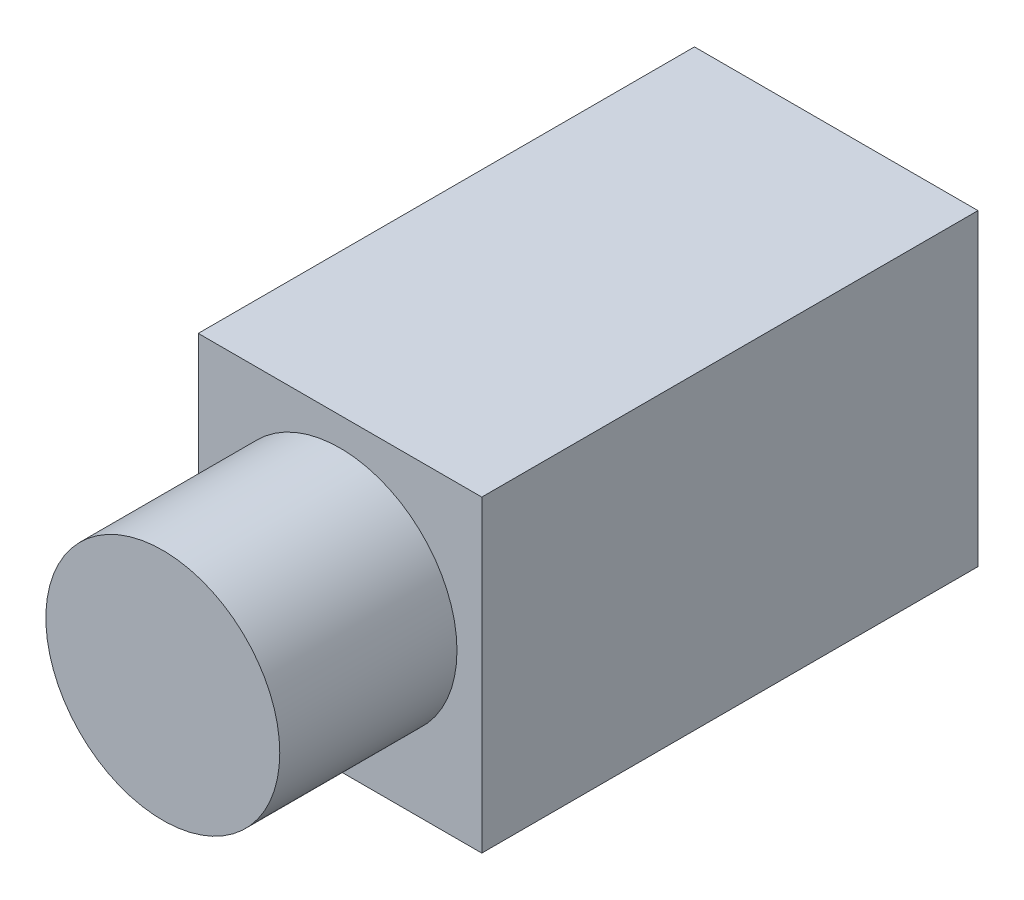
ISO-10303-21;
HEADER;
FILE_DESCRIPTION(('STEP AP214'),'2;1');
FILE_NAME('part.step','',(''),(''),'','','');
FILE_SCHEMA(('AUTOMOTIVE_DESIGN { 1 0 10303 214 1 1 1 1 }'));
ENDSEC;
DATA;
#1=APPLICATION_CONTEXT('core data for automotive mechanical design processes');
#2=APPLICATION_PROTOCOL_DEFINITION('international standard','automotive_design',2000,#1);
#3=PRODUCT_CONTEXT('',#1,'mechanical');
#4=PRODUCT('Part','Part','',(#3));
#5=PRODUCT_RELATED_PRODUCT_CATEGORY('part','',(#4));
#6=PRODUCT_DEFINITION_FORMATION('','',#4);
#7=PRODUCT_DEFINITION_CONTEXT('part definition',#1,'design');
#8=PRODUCT_DEFINITION('design','',#6,#7);
#9=PRODUCT_DEFINITION_SHAPE('','',#8);
#10=(LENGTH_UNIT() NAMED_UNIT(*) SI_UNIT(.MILLI.,.METRE.));
#11=(NAMED_UNIT(*) PLANE_ANGLE_UNIT() SI_UNIT($,.RADIAN.));
#12=(NAMED_UNIT(*) SI_UNIT($,.STERADIAN.) SOLID_ANGLE_UNIT());
#13=UNCERTAINTY_MEASURE_WITH_UNIT(LENGTH_MEASURE(1.E-05),#10,'distance_accuracy_value','');
#14=(GEOMETRIC_REPRESENTATION_CONTEXT(3) GLOBAL_UNCERTAINTY_ASSIGNED_CONTEXT((#13)) GLOBAL_UNIT_ASSIGNED_CONTEXT((#10,
#11,#12)) REPRESENTATION_CONTEXT('',''));
#15=CARTESIAN_POINT('',(0.,0.,0.));
#16=DIRECTION('',(0.,0.,1.));
#17=DIRECTION('',(1.,0.,0.));
#18=AXIS2_PLACEMENT_3D('',#15,#16,#17);
#19=CARTESIAN_POINT('',(20.,43.5,35.));
#20=DIRECTION('',(-1.,0.,0.));
#21=DIRECTION('',(0.,0.,1.));
#22=AXIS2_PLACEMENT_3D('',#19,#20,#21);
#23=PLANE('',#22);
#24=DIRECTION('',(0.,0.,-1.));
#25=VECTOR('',#24,1.);
#26=CARTESIAN_POINT('',(20.,0.,35.));
#27=LINE('',#26,#25);
#28=CARTESIAN_POINT('',(20.,0.,35.));
#29=VERTEX_POINT('',#28);
#30=CARTESIAN_POINT('',(20.,0.,-35.));
#31=VERTEX_POINT('',#30);
#32=EDGE_CURVE('E140',#29,#31,#27,.T.);
#33=ORIENTED_EDGE('',*,*,#32,.T.);
#34=DIRECTION('',(0.,-1.,0.));
#35=VECTOR('',#34,1.);
#36=CARTESIAN_POINT('',(20.,43.5,-35.));
#37=LINE('',#36,#35);
#38=CARTESIAN_POINT('',(20.,43.5,-35.));
#39=VERTEX_POINT('',#38);
#40=EDGE_CURVE('E46',#39,#31,#37,.T.);
#41=ORIENTED_EDGE('',*,*,#40,.F.);
#42=DIRECTION('',(0.,0.,-1.));
#43=VECTOR('',#42,1.);
#44=CARTESIAN_POINT('',(20.,43.5,35.));
#45=LINE('',#44,#43);
#46=CARTESIAN_POINT('',(20.,43.5,35.));
#47=VERTEX_POINT('',#46);
#48=EDGE_CURVE('E142',#47,#39,#45,.T.);
#49=ORIENTED_EDGE('',*,*,#48,.F.);
#50=DIRECTION('',(0.,-1.,0.));
#51=VECTOR('',#50,1.);
#52=CARTESIAN_POINT('',(20.,43.5,35.));
#53=LINE('',#52,#51);
#54=EDGE_CURVE('E148',#47,#29,#53,.T.);
#55=ORIENTED_EDGE('',*,*,#54,.T.);
#56=EDGE_LOOP('',(#33,#41,#49,#55));
#57=FACE_BOUND('',#56,.T.);
#58=ADVANCED_FACE('F43',(#57),#23,.F.);
#59=CARTESIAN_POINT('',(-20.,43.5,-35.));
#60=DIRECTION('',(0.,0.,1.));
#61=DIRECTION('',(1.,0.,0.));
#62=AXIS2_PLACEMENT_3D('',#59,#60,#61);
#63=PLANE('',#62);
#64=DIRECTION('',(-1.,0.,0.));
#65=VECTOR('',#64,1.);
#66=CARTESIAN_POINT('',(-20.,0.,-35.));
#67=LINE('',#66,#65);
#68=CARTESIAN_POINT('',(-20.,0.,-35.));
#69=VERTEX_POINT('',#68);
#70=EDGE_CURVE('E151',#31,#69,#67,.T.);
#71=ORIENTED_EDGE('',*,*,#70,.T.);
#72=DIRECTION('',(0.,-1.,0.));
#73=VECTOR('',#72,1.);
#74=CARTESIAN_POINT('',(-20.,43.5,-35.));
#75=LINE('',#74,#73);
#76=CARTESIAN_POINT('',(-20.,43.5,-35.));
#77=VERTEX_POINT('',#76);
#78=EDGE_CURVE('E157',#77,#69,#75,.T.);
#79=ORIENTED_EDGE('',*,*,#78,.F.);
#80=DIRECTION('',(-1.,0.,0.));
#81=VECTOR('',#80,1.);
#82=CARTESIAN_POINT('',(-20.,43.5,-35.));
#83=LINE('',#82,#81);
#84=EDGE_CURVE('E92',#39,#77,#83,.T.);
#85=ORIENTED_EDGE('',*,*,#84,.F.);
#86=ORIENTED_EDGE('',*,*,#40,.T.);
#87=EDGE_LOOP('',(#71,#79,#85,#86));
#88=FACE_BOUND('',#87,.T.);
#89=ADVANCED_FACE('F160',(#88),#63,.F.);
#90=CARTESIAN_POINT('',(-20.,43.5,35.));
#91=DIRECTION('',(1.,0.,0.));
#92=DIRECTION('',(0.,0.,-1.));
#93=AXIS2_PLACEMENT_3D('',#90,#91,#92);
#94=PLANE('',#93);
#95=DIRECTION('',(0.,0.,1.));
#96=VECTOR('',#95,1.);
#97=CARTESIAN_POINT('',(-20.,0.,35.));
#98=LINE('',#97,#96);
#99=CARTESIAN_POINT('',(-20.,0.,35.));
#100=VERTEX_POINT('',#99);
#101=EDGE_CURVE('E78',#69,#100,#98,.T.);
#102=ORIENTED_EDGE('',*,*,#101,.T.);
#103=DIRECTION('',(0.,-1.,0.));
#104=VECTOR('',#103,1.);
#105=CARTESIAN_POINT('',(-20.,43.5,35.));
#106=LINE('',#105,#104);
#107=CARTESIAN_POINT('',(-20.,43.5,35.));
#108=VERTEX_POINT('',#107);
#109=EDGE_CURVE('E156',#108,#100,#106,.T.);
#110=ORIENTED_EDGE('',*,*,#109,.F.);
#111=DIRECTION('',(0.,0.,1.));
#112=VECTOR('',#111,1.);
#113=CARTESIAN_POINT('',(-20.,43.5,35.));
#114=LINE('',#113,#112);
#115=EDGE_CURVE('E145',#77,#108,#114,.T.);
#116=ORIENTED_EDGE('',*,*,#115,.F.);
#117=ORIENTED_EDGE('',*,*,#78,.T.);
#118=EDGE_LOOP('',(#102,#110,#116,#117));
#119=FACE_BOUND('',#118,.T.);
#120=ADVANCED_FACE('F189',(#119),#94,.F.);
#121=CARTESIAN_POINT('',(-20.,43.5,35.));
#122=DIRECTION('',(0.,0.,-1.));
#123=DIRECTION('',(-1.,0.,0.));
#124=AXIS2_PLACEMENT_3D('',#121,#122,#123);
#125=PLANE('',#124);
#126=CARTESIAN_POINT('',(0.,23.,35.));
#127=DIRECTION('',(0.,0.,1.));
#128=DIRECTION('',(1.,0.,0.));
#129=AXIS2_PLACEMENT_3D('',#126,#127,#128);
#130=CIRCLE('',#129,16.5);
#131=CARTESIAN_POINT('',(16.5,23.,35.));
#132=VERTEX_POINT('',#131);
#133=EDGE_CURVE('E11',#132,#132,#130,.T.);
#134=ORIENTED_EDGE('',*,*,#133,.F.);
#135=EDGE_LOOP('',(#134));
#136=FACE_BOUND('',#135,.T.);
#137=DIRECTION('',(1.,0.,0.));
#138=VECTOR('',#137,1.);
#139=CARTESIAN_POINT('',(-20.,0.,35.));
#140=LINE('',#139,#138);
#141=EDGE_CURVE('E84',#100,#29,#140,.T.);
#142=ORIENTED_EDGE('',*,*,#141,.T.);
#143=ORIENTED_EDGE('',*,*,#54,.F.);
#144=DIRECTION('',(1.,0.,0.));
#145=VECTOR('',#144,1.);
#146=CARTESIAN_POINT('',(-20.,43.5,35.));
#147=LINE('',#146,#145);
#148=EDGE_CURVE('E60',#108,#47,#147,.T.);
#149=ORIENTED_EDGE('',*,*,#148,.F.);
#150=ORIENTED_EDGE('',*,*,#109,.T.);
#151=EDGE_LOOP('',(#142,#143,#149,#150));
#152=FACE_BOUND('',#151,.T.);
#153=ADVANCED_FACE('F180',(#136,#152),#125,.F.);
#154=CARTESIAN_POINT('',(0.,43.5,0.));
#155=DIRECTION('',(0.,-1.,0.));
#156=DIRECTION('',(0.,0.,-1.));
#157=AXIS2_PLACEMENT_3D('',#154,#155,#156);
#158=PLANE('',#157);
#159=ORIENTED_EDGE('',*,*,#48,.T.);
#160=ORIENTED_EDGE('',*,*,#84,.T.);
#161=ORIENTED_EDGE('',*,*,#115,.T.);
#162=ORIENTED_EDGE('',*,*,#148,.T.);
#163=EDGE_LOOP('',(#159,#160,#161,#162));
#164=FACE_BOUND('',#163,.T.);
#165=ADVANCED_FACE('F168',(#164),#158,.F.);
#166=CARTESIAN_POINT('',(0.,0.,0.));
#167=DIRECTION('',(0.,-1.,0.));
#168=DIRECTION('',(0.,0.,-1.));
#169=AXIS2_PLACEMENT_3D('',#166,#167,#168);
#170=PLANE('',#169);
#171=CARTESIAN_POINT('',(7.,0.,-20.));
#172=DIRECTION('',(0.,-1.,0.));
#173=DIRECTION('',(0.,0.,-1.));
#174=AXIS2_PLACEMENT_3D('',#171,#172,#173);
#175=CIRCLE('',#174,1.59999999999999);
#176=CARTESIAN_POINT('',(7.,0.,-21.6));
#177=VERTEX_POINT('',#176);
#178=EDGE_CURVE('E116',#177,#177,#175,.T.);
#179=ORIENTED_EDGE('',*,*,#178,.F.);
#180=EDGE_LOOP('',(#179));
#181=FACE_BOUND('',#180,.T.);
#182=CARTESIAN_POINT('',(-7.,0.,-20.));
#183=DIRECTION('',(0.,-1.,0.));
#184=DIRECTION('',(0.,0.,-1.));
#185=AXIS2_PLACEMENT_3D('',#182,#183,#184);
#186=CIRCLE('',#185,1.59999999999999);
#187=CARTESIAN_POINT('',(-7.,0.,-21.6));
#188=VERTEX_POINT('',#187);
#189=EDGE_CURVE('E115',#188,#188,#186,.T.);
#190=ORIENTED_EDGE('',*,*,#189,.F.);
#191=EDGE_LOOP('',(#190));
#192=FACE_BOUND('',#191,.T.);
#193=CARTESIAN_POINT('',(-7.,0.,25.));
#194=DIRECTION('',(0.,-1.,0.));
#195=DIRECTION('',(0.,0.,-1.));
#196=AXIS2_PLACEMENT_3D('',#193,#194,#195);
#197=CIRCLE('',#196,1.59999999999999);
#198=CARTESIAN_POINT('',(-7.,0.,23.4));
#199=VERTEX_POINT('',#198);
#200=EDGE_CURVE('E126',#199,#199,#197,.T.);
#201=ORIENTED_EDGE('',*,*,#200,.F.);
#202=EDGE_LOOP('',(#201));
#203=FACE_BOUND('',#202,.T.);
#204=CARTESIAN_POINT('',(7.,0.,25.));
#205=DIRECTION('',(0.,-1.,0.));
#206=DIRECTION('',(0.,0.,-1.));
#207=AXIS2_PLACEMENT_3D('',#204,#205,#206);
#208=CIRCLE('',#207,1.59999999999999);
#209=CARTESIAN_POINT('',(7.,0.,23.4));
#210=VERTEX_POINT('',#209);
#211=EDGE_CURVE('E132',#210,#210,#208,.T.);
#212=ORIENTED_EDGE('',*,*,#211,.F.);
#213=EDGE_LOOP('',(#212));
#214=FACE_BOUND('',#213,.T.);
#215=ORIENTED_EDGE('',*,*,#32,.F.);
#216=ORIENTED_EDGE('',*,*,#141,.F.);
#217=ORIENTED_EDGE('',*,*,#101,.F.);
#218=ORIENTED_EDGE('',*,*,#70,.F.);
#219=EDGE_LOOP('',(#215,#216,#217,#218));
#220=FACE_BOUND('',#219,.T.);
#221=ADVANCED_FACE('F165',(#181,#192,#203,#214,#220),#170,.T.);
#222=CARTESIAN_POINT('',(0.,23.,60.));
#223=DIRECTION('',(0.,0.,-1.));
#224=DIRECTION('',(-1.,0.,0.));
#225=AXIS2_PLACEMENT_3D('',#222,#223,#224);
#226=CYLINDRICAL_SURFACE('',#225,16.5);
#227=CARTESIAN_POINT('',(0.,23.,60.));
#228=DIRECTION('',(0.,0.,1.));
#229=DIRECTION('',(1.,0.,0.));
#230=AXIS2_PLACEMENT_3D('',#227,#228,#229);
#231=CIRCLE('',#230,16.5);
#232=CARTESIAN_POINT('',(16.5,23.,60.));
#233=VERTEX_POINT('',#232);
#234=EDGE_CURVE('E138',#233,#233,#231,.T.);
#235=ORIENTED_EDGE('',*,*,#234,.F.);
#236=EDGE_LOOP('',(#235));
#237=FACE_BOUND('',#236,.T.);
#238=ORIENTED_EDGE('',*,*,#133,.T.);
#239=EDGE_LOOP('',(#238));
#240=FACE_BOUND('',#239,.T.);
#241=ADVANCED_FACE('F167',(#237,#240),#226,.T.);
#242=CARTESIAN_POINT('',(0.,23.,60.));
#243=DIRECTION('',(0.,0.,1.));
#244=DIRECTION('',(1.,0.,0.));
#245=AXIS2_PLACEMENT_3D('',#242,#243,#244);
#246=PLANE('',#245);
#247=ORIENTED_EDGE('',*,*,#234,.T.);
#248=EDGE_LOOP('',(#247));
#249=FACE_BOUND('',#248,.T.);
#250=ADVANCED_FACE('F176',(#249),#246,.T.);
#251=CARTESIAN_POINT('',(7.,3.18,25.));
#252=DIRECTION('',(0.,-1.,0.));
#253=DIRECTION('',(0.,0.,-1.));
#254=AXIS2_PLACEMENT_3D('',#251,#252,#253);
#255=CONICAL_SURFACE('',#254,1.59999999999999,1.02974425867665);
#256=CARTESIAN_POINT('',(7.,4.14137699044409,25.));
#257=VERTEX_POINT('',#256);
#258=VERTEX_LOOP('',#257);
#259=FACE_BOUND('',#258,.T.);
#260=CARTESIAN_POINT('',(7.,3.18,25.));
#261=DIRECTION('',(0.,-1.,0.));
#262=DIRECTION('',(0.,0.,-1.));
#263=AXIS2_PLACEMENT_3D('',#260,#261,#262);
#264=CIRCLE('',#263,1.59999999999999);
#265=CARTESIAN_POINT('',(7.,3.18,23.4));
#266=VERTEX_POINT('',#265);
#267=EDGE_CURVE('E135',#266,#266,#264,.T.);
#268=ORIENTED_EDGE('',*,*,#267,.T.);
#269=EDGE_LOOP('',(#268));
#270=FACE_BOUND('',#269,.T.);
#271=ADVANCED_FACE('F213',(#259,#270),#255,.F.);
#272=CARTESIAN_POINT('',(7.,0.,25.));
#273=DIRECTION('',(0.,-1.,0.));
#274=DIRECTION('',(0.,0.,-1.));
#275=AXIS2_PLACEMENT_3D('',#272,#273,#274);
#276=CYLINDRICAL_SURFACE('',#275,1.59999999999999);
#277=ORIENTED_EDGE('',*,*,#267,.F.);
#278=EDGE_LOOP('',(#277));
#279=FACE_BOUND('',#278,.T.);
#280=ORIENTED_EDGE('',*,*,#211,.T.);
#281=EDGE_LOOP('',(#280));
#282=FACE_BOUND('',#281,.T.);
#283=ADVANCED_FACE('F225',(#279,#282),#276,.F.);
#284=CARTESIAN_POINT('',(-7.,3.18,25.));
#285=DIRECTION('',(0.,-1.,0.));
#286=DIRECTION('',(0.,0.,-1.));
#287=AXIS2_PLACEMENT_3D('',#284,#285,#286);
#288=CONICAL_SURFACE('',#287,1.59999999999999,1.02974425867665);
#289=CARTESIAN_POINT('',(-7.,4.14137699044409,25.));
#290=VERTEX_POINT('',#289);
#291=VERTEX_LOOP('',#290);
#292=FACE_BOUND('',#291,.T.);
#293=CARTESIAN_POINT('',(-7.,3.18,25.));
#294=DIRECTION('',(0.,-1.,0.));
#295=DIRECTION('',(0.,0.,-1.));
#296=AXIS2_PLACEMENT_3D('',#293,#294,#295);
#297=CIRCLE('',#296,1.59999999999999);
#298=CARTESIAN_POINT('',(-7.,3.18,23.4));
#299=VERTEX_POINT('',#298);
#300=EDGE_CURVE('E129',#299,#299,#297,.T.);
#301=ORIENTED_EDGE('',*,*,#300,.T.);
#302=EDGE_LOOP('',(#301));
#303=FACE_BOUND('',#302,.T.);
#304=ADVANCED_FACE('F235',(#292,#303),#288,.F.);
#305=CARTESIAN_POINT('',(-7.,0.,25.));
#306=DIRECTION('',(0.,-1.,0.));
#307=DIRECTION('',(0.,0.,-1.));
#308=AXIS2_PLACEMENT_3D('',#305,#306,#307);
#309=CYLINDRICAL_SURFACE('',#308,1.59999999999999);
#310=ORIENTED_EDGE('',*,*,#300,.F.);
#311=EDGE_LOOP('',(#310));
#312=FACE_BOUND('',#311,.T.);
#313=ORIENTED_EDGE('',*,*,#200,.T.);
#314=EDGE_LOOP('',(#313));
#315=FACE_BOUND('',#314,.T.);
#316=ADVANCED_FACE('F245',(#312,#315),#309,.F.);
#317=CARTESIAN_POINT('',(-7.,3.18,-20.));
#318=DIRECTION('',(0.,-1.,0.));
#319=DIRECTION('',(0.,0.,-1.));
#320=AXIS2_PLACEMENT_3D('',#317,#318,#319);
#321=CONICAL_SURFACE('',#320,1.59999999999999,1.02974425867665);
#322=CARTESIAN_POINT('',(-7.,4.14137699044409,-20.));
#323=VERTEX_POINT('',#322);
#324=VERTEX_LOOP('',#323);
#325=FACE_BOUND('',#324,.T.);
#326=CARTESIAN_POINT('',(-7.,3.18,-20.));
#327=DIRECTION('',(0.,-1.,0.));
#328=DIRECTION('',(0.,0.,-1.));
#329=AXIS2_PLACEMENT_3D('',#326,#327,#328);
#330=CIRCLE('',#329,1.59999999999999);
#331=CARTESIAN_POINT('',(-7.,3.18,-21.6));
#332=VERTEX_POINT('',#331);
#333=EDGE_CURVE('E119',#332,#332,#330,.T.);
#334=ORIENTED_EDGE('',*,*,#333,.T.);
#335=EDGE_LOOP('',(#334));
#336=FACE_BOUND('',#335,.T.);
#337=ADVANCED_FACE('F255',(#325,#336),#321,.F.);
#338=CARTESIAN_POINT('',(-7.,0.,-20.));
#339=DIRECTION('',(0.,-1.,0.));
#340=DIRECTION('',(0.,0.,-1.));
#341=AXIS2_PLACEMENT_3D('',#338,#339,#340);
#342=CYLINDRICAL_SURFACE('',#341,1.59999999999999);
#343=ORIENTED_EDGE('',*,*,#333,.F.);
#344=EDGE_LOOP('',(#343));
#345=FACE_BOUND('',#344,.T.);
#346=ORIENTED_EDGE('',*,*,#189,.T.);
#347=EDGE_LOOP('',(#346));
#348=FACE_BOUND('',#347,.T.);
#349=ADVANCED_FACE('F109',(#345,#348),#342,.F.);
#350=CARTESIAN_POINT('',(7.,3.18,-20.));
#351=DIRECTION('',(0.,-1.,0.));
#352=DIRECTION('',(0.,0.,-1.));
#353=AXIS2_PLACEMENT_3D('',#350,#351,#352);
#354=CONICAL_SURFACE('',#353,1.59999999999999,1.02974425867665);
#355=CARTESIAN_POINT('',(7.,4.14137699044409,-20.));
#356=VERTEX_POINT('',#355);
#357=VERTEX_LOOP('',#356);
#358=FACE_BOUND('',#357,.T.);
#359=CARTESIAN_POINT('',(7.,3.18,-20.));
#360=DIRECTION('',(0.,-1.,0.));
#361=DIRECTION('',(0.,0.,-1.));
#362=AXIS2_PLACEMENT_3D('',#359,#360,#361);
#363=CIRCLE('',#362,1.59999999999999);
#364=CARTESIAN_POINT('',(7.,3.18,-21.6));
#365=VERTEX_POINT('',#364);
#366=EDGE_CURVE('E113',#365,#365,#363,.T.);
#367=ORIENTED_EDGE('',*,*,#366,.T.);
#368=EDGE_LOOP('',(#367));
#369=FACE_BOUND('',#368,.T.);
#370=ADVANCED_FACE('F105',(#358,#369),#354,.F.);
#371=CARTESIAN_POINT('',(7.,0.,-20.));
#372=DIRECTION('',(0.,-1.,0.));
#373=DIRECTION('',(0.,0.,-1.));
#374=AXIS2_PLACEMENT_3D('',#371,#372,#373);
#375=CYLINDRICAL_SURFACE('',#374,1.59999999999999);
#376=ORIENTED_EDGE('',*,*,#366,.F.);
#377=EDGE_LOOP('',(#376));
#378=FACE_BOUND('',#377,.T.);
#379=ORIENTED_EDGE('',*,*,#178,.T.);
#380=EDGE_LOOP('',(#379));
#381=FACE_BOUND('',#380,.T.);
#382=ADVANCED_FACE('F108',(#378,#381),#375,.F.);
#383=CLOSED_SHELL('',(#58,#89,#120,#153,#165,#221,#241,#250,#271,#283,#304,#316,#337,#349,#370,#382));
#384=MANIFOLD_SOLID_BREP('B2',#383);
#385=ADVANCED_BREP_SHAPE_REPRESENTATION('',(#18,#384),#14);
#386=SHAPE_DEFINITION_REPRESENTATION(#9,#385);
ENDSEC;
END-ISO-10303-21;
